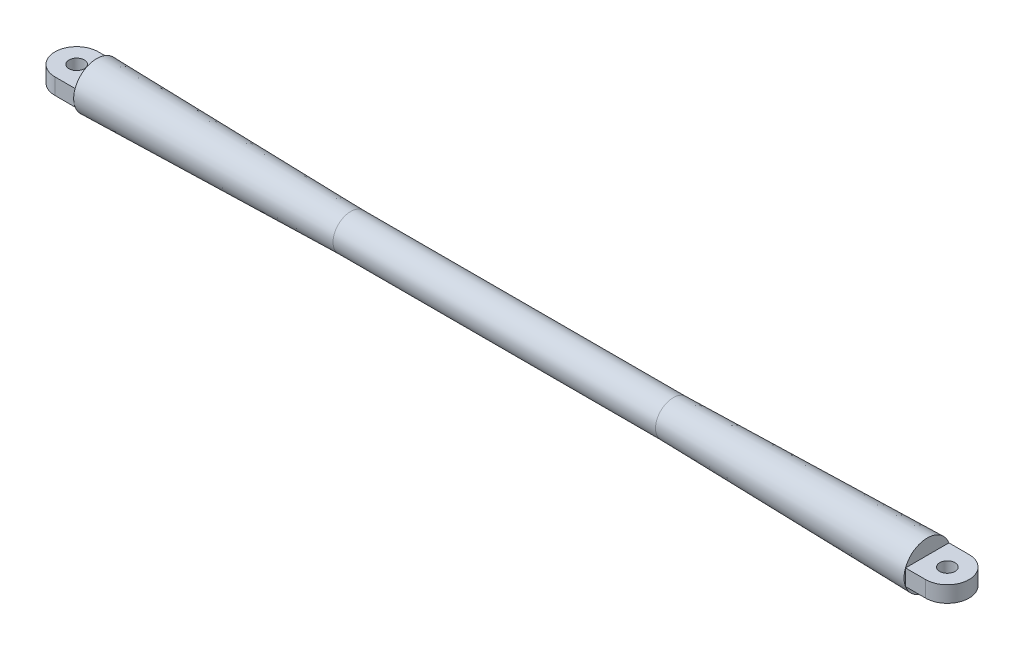
ISO-10303-21;
HEADER;
FILE_DESCRIPTION(('STEP AP214'),'2;1');
FILE_NAME('part.step','',(''),(''),'','','');
FILE_SCHEMA(('AUTOMOTIVE_DESIGN { 1 0 10303 214 1 1 1 1 }'));
ENDSEC;
DATA;
#1=APPLICATION_CONTEXT('core data for automotive mechanical design processes');
#2=APPLICATION_PROTOCOL_DEFINITION('international standard','automotive_design',2000,#1);
#3=PRODUCT_CONTEXT('',#1,'mechanical');
#4=PRODUCT('Part','Part','',(#3));
#5=PRODUCT_RELATED_PRODUCT_CATEGORY('part','',(#4));
#6=PRODUCT_DEFINITION_FORMATION('','',#4);
#7=PRODUCT_DEFINITION_CONTEXT('part definition',#1,'design');
#8=PRODUCT_DEFINITION('design','',#6,#7);
#9=PRODUCT_DEFINITION_SHAPE('','',#8);
#10=(LENGTH_UNIT() NAMED_UNIT(*) SI_UNIT(.MILLI.,.METRE.));
#11=(NAMED_UNIT(*) PLANE_ANGLE_UNIT() SI_UNIT($,.RADIAN.));
#12=(NAMED_UNIT(*) SI_UNIT($,.STERADIAN.) SOLID_ANGLE_UNIT());
#13=UNCERTAINTY_MEASURE_WITH_UNIT(LENGTH_MEASURE(1.E-05),#10,'distance_accuracy_value','');
#14=(GEOMETRIC_REPRESENTATION_CONTEXT(3) GLOBAL_UNCERTAINTY_ASSIGNED_CONTEXT((#13)) GLOBAL_UNIT_ASSIGNED_CONTEXT((#10,
#11,#12)) REPRESENTATION_CONTEXT('',''));
#15=CARTESIAN_POINT('',(0.,0.,0.));
#16=DIRECTION('',(0.,0.,1.));
#17=DIRECTION('',(1.,0.,0.));
#18=AXIS2_PLACEMENT_3D('',#15,#16,#17);
#19=CARTESIAN_POINT('',(575.,0.,0.));
#20=DIRECTION('',(1.,0.,0.));
#21=DIRECTION('',(0.,0.,-1.));
#22=AXIS2_PLACEMENT_3D('',#19,#20,#21);
#23=CONICAL_SURFACE('',#22,30.,0.0213300978711052);
#24=CARTESIAN_POINT('',(200.,0.,0.));
#25=DIRECTION('',(-1.,0.,0.));
#26=DIRECTION('',(0.,0.,1.));
#27=AXIS2_PLACEMENT_3D('',#24,#25,#26);
#28=CIRCLE('',#27,22.);
#29=CARTESIAN_POINT('',(200.,0.,22.));
#30=VERTEX_POINT('',#29);
#31=EDGE_CURVE('E182',#30,#30,#28,.T.);
#32=ORIENTED_EDGE('',*,*,#31,.F.);
#33=EDGE_LOOP('',(#32));
#34=FACE_BOUND('',#33,.T.);
#35=CARTESIAN_POINT('',(515.,0.,0.));
#36=DIRECTION('',(-1.,0.,0.));
#37=DIRECTION('',(0.,0.,1.));
#38=AXIS2_PLACEMENT_3D('',#35,#36,#37);
#39=CIRCLE('',#38,28.72);
#40=CARTESIAN_POINT('',(515.,10.,26.9228230317699));
#41=VERTEX_POINT('',#40);
#42=CARTESIAN_POINT('',(515.,10.,-26.9228230317699));
#43=VERTEX_POINT('',#42);
#44=EDGE_CURVE('E185',#41,#43,#39,.T.);
#45=ORIENTED_EDGE('',*,*,#44,.T.);
#46=CARTESIAN_POINT('',(515.,0.,0.));
#47=DIRECTION('',(-1.,0.,0.));
#48=DIRECTION('',(0.,-1.,0.));
#49=AXIS2_PLACEMENT_3D('',#46,#47,#48);
#50=CIRCLE('',#49,28.72);
#51=CARTESIAN_POINT('',(515.,-10.,-26.9228230317699));
#52=VERTEX_POINT('',#51);
#53=EDGE_CURVE('E173',#43,#52,#50,.T.);
#54=ORIENTED_EDGE('',*,*,#53,.T.);
#55=CARTESIAN_POINT('',(515.,0.,0.));
#56=DIRECTION('',(-1.,0.,0.));
#57=DIRECTION('',(0.,0.,1.));
#58=AXIS2_PLACEMENT_3D('',#55,#56,#57);
#59=CIRCLE('',#58,28.72);
#60=CARTESIAN_POINT('',(515.,-10.,26.9228230317699));
#61=VERTEX_POINT('',#60);
#62=EDGE_CURVE('E188',#52,#61,#59,.T.);
#63=ORIENTED_EDGE('',*,*,#62,.T.);
#64=CARTESIAN_POINT('',(515.,0.,0.));
#65=DIRECTION('',(-1.,0.,0.));
#66=DIRECTION('',(0.,-1.,0.));
#67=AXIS2_PLACEMENT_3D('',#64,#65,#66);
#68=CIRCLE('',#67,28.72);
#69=EDGE_CURVE('E170',#61,#41,#68,.T.);
#70=ORIENTED_EDGE('',*,*,#69,.T.);
#71=EDGE_LOOP('',(#45,#54,#63,#70));
#72=FACE_BOUND('',#71,.T.);
#73=ADVANCED_FACE('F32',(#34,#72),#23,.T.);
#74=CARTESIAN_POINT('',(0.,0.,0.));
#75=DIRECTION('',(-1.,0.,0.));
#76=DIRECTION('',(0.,0.,1.));
#77=AXIS2_PLACEMENT_3D('',#74,#75,#76);
#78=CYLINDRICAL_SURFACE('',#77,22.);
#79=ORIENTED_EDGE('',*,*,#31,.T.);
#80=EDGE_LOOP('',(#79));
#81=FACE_BOUND('',#80,.T.);
#82=CARTESIAN_POINT('',(-200.,0.,0.));
#83=DIRECTION('',(-1.,0.,0.));
#84=DIRECTION('',(0.,0.,1.));
#85=AXIS2_PLACEMENT_3D('',#82,#83,#84);
#86=CIRCLE('',#85,22.);
#87=CARTESIAN_POINT('',(-200.,0.,22.));
#88=VERTEX_POINT('',#87);
#89=EDGE_CURVE('E141',#88,#88,#86,.T.);
#90=ORIENTED_EDGE('',*,*,#89,.F.);
#91=EDGE_LOOP('',(#90));
#92=FACE_BOUND('',#91,.T.);
#93=ADVANCED_FACE('F224',(#81,#92),#78,.T.);
#94=CARTESIAN_POINT('',(515.,78.038595238584,-95.));
#95=DIRECTION('',(-1.,0.,0.));
#96=DIRECTION('',(0.,0.,1.));
#97=AXIS2_PLACEMENT_3D('',#94,#95,#96);
#98=PLANE('',#97);
#99=DIRECTION('',(0.,0.,1.));
#100=VECTOR('',#99,1.);
#101=CARTESIAN_POINT('',(515.,9.99999999999999,-95.));
#102=LINE('',#101,#100);
#103=EDGE_CURVE('E179',#43,#41,#102,.T.);
#104=ORIENTED_EDGE('',*,*,#103,.F.);
#105=ORIENTED_EDGE('',*,*,#44,.F.);
#106=EDGE_LOOP('',(#104,#105));
#107=FACE_BOUND('',#106,.T.);
#108=ADVANCED_FACE('F207',(#107),#98,.F.);
#109=CARTESIAN_POINT('',(515.,9.99999999999999,-95.));
#110=DIRECTION('',(0.,-1.,0.));
#111=DIRECTION('',(1.,0.,0.));
#112=AXIS2_PLACEMENT_3D('',#109,#110,#111);
#113=PLANE('',#112);
#114=CARTESIAN_POINT('',(540.,10.,0.));
#115=DIRECTION('',(0.,1.,0.));
#116=DIRECTION('',(-1.,0.,0.));
#117=AXIS2_PLACEMENT_3D('',#114,#115,#116);
#118=CIRCLE('',#117,9.49999999999995);
#119=CARTESIAN_POINT('',(530.5,9.99999999999999,0.));
#120=VERTEX_POINT('',#119);
#121=EDGE_CURVE('E149',#120,#120,#118,.T.);
#122=ORIENTED_EDGE('',*,*,#121,.F.);
#123=EDGE_LOOP('',(#122));
#124=FACE_BOUND('',#123,.T.);
#125=ORIENTED_EDGE('',*,*,#103,.T.);
#126=DIRECTION('',(1.,0.,0.));
#127=VECTOR('',#126,1.);
#128=CARTESIAN_POINT('',(515.,9.99999999999999,26.9228230317699));
#129=LINE('',#128,#127);
#130=CARTESIAN_POINT('',(540.,9.99999999999998,26.9228230317699));
#131=VERTEX_POINT('',#130);
#132=EDGE_CURVE('E55',#41,#131,#129,.T.);
#133=ORIENTED_EDGE('',*,*,#132,.T.);
#134=CARTESIAN_POINT('',(540.,9.99999999999998,0.));
#135=DIRECTION('',(0.,-1.,0.));
#136=DIRECTION('',(1.,0.,0.));
#137=AXIS2_PLACEMENT_3D('',#134,#135,#136);
#138=CIRCLE('',#137,26.9228230317699);
#139=CARTESIAN_POINT('',(540.,9.99999999999998,-26.9228230317699));
#140=VERTEX_POINT('',#139);
#141=EDGE_CURVE('E166',#131,#140,#138,.F.);
#142=ORIENTED_EDGE('',*,*,#141,.T.);
#143=DIRECTION('',(-1.,0.,0.));
#144=VECTOR('',#143,1.);
#145=CARTESIAN_POINT('',(515.,9.99999999999999,-26.9228230317699));
#146=LINE('',#145,#144);
#147=EDGE_CURVE('E157',#140,#43,#146,.T.);
#148=ORIENTED_EDGE('',*,*,#147,.T.);
#149=EDGE_LOOP('',(#125,#133,#142,#148));
#150=FACE_BOUND('',#149,.T.);
#151=ADVANCED_FACE('F203',(#124,#150),#113,.F.);
#152=CARTESIAN_POINT('',(515.,-78.038595238584,-95.));
#153=DIRECTION('',(-1.,0.,0.));
#154=DIRECTION('',(0.,0.,1.));
#155=AXIS2_PLACEMENT_3D('',#152,#153,#154);
#156=PLANE('',#155);
#157=DIRECTION('',(0.,0.,1.));
#158=VECTOR('',#157,1.);
#159=CARTESIAN_POINT('',(515.,-9.99999999999999,-95.));
#160=LINE('',#159,#158);
#161=EDGE_CURVE('E176',#52,#61,#160,.T.);
#162=ORIENTED_EDGE('',*,*,#161,.T.);
#163=ORIENTED_EDGE('',*,*,#62,.F.);
#164=EDGE_LOOP('',(#162,#163));
#165=FACE_BOUND('',#164,.T.);
#166=ADVANCED_FACE('F294',(#165),#156,.F.);
#167=CARTESIAN_POINT('',(515.,-9.99999999999999,-95.));
#168=DIRECTION('',(0.,1.,0.));
#169=DIRECTION('',(-1.,0.,0.));
#170=AXIS2_PLACEMENT_3D('',#167,#168,#169);
#171=PLANE('',#170);
#172=CARTESIAN_POINT('',(540.,-9.99999999999999,0.));
#173=DIRECTION('',(0.,1.,0.));
#174=DIRECTION('',(-1.,0.,0.));
#175=AXIS2_PLACEMENT_3D('',#172,#173,#174);
#176=CIRCLE('',#175,9.49999999999995);
#177=CARTESIAN_POINT('',(530.5,-9.99999999999999,0.));
#178=VERTEX_POINT('',#177);
#179=EDGE_CURVE('E35',#178,#178,#176,.T.);
#180=ORIENTED_EDGE('',*,*,#179,.T.);
#181=EDGE_LOOP('',(#180));
#182=FACE_BOUND('',#181,.T.);
#183=CARTESIAN_POINT('',(540.,-9.99999999999998,0.));
#184=DIRECTION('',(0.,1.,0.));
#185=DIRECTION('',(-1.,0.,0.));
#186=AXIS2_PLACEMENT_3D('',#183,#184,#185);
#187=CIRCLE('',#186,26.9228230317699);
#188=CARTESIAN_POINT('',(540.,-10.,-26.9228230317699));
#189=VERTEX_POINT('',#188);
#190=CARTESIAN_POINT('',(540.,-9.99999999999998,26.9228230317699));
#191=VERTEX_POINT('',#190);
#192=EDGE_CURVE('E40',#189,#191,#187,.F.);
#193=ORIENTED_EDGE('',*,*,#192,.T.);
#194=DIRECTION('',(-1.,0.,0.));
#195=VECTOR('',#194,1.);
#196=CARTESIAN_POINT('',(515.,-9.99999999999999,26.9228230317699));
#197=LINE('',#196,#195);
#198=EDGE_CURVE('E11',#191,#61,#197,.T.);
#199=ORIENTED_EDGE('',*,*,#198,.T.);
#200=ORIENTED_EDGE('',*,*,#161,.F.);
#201=DIRECTION('',(1.,0.,0.));
#202=VECTOR('',#201,1.);
#203=CARTESIAN_POINT('',(515.,-9.99999999999999,-26.9228230317699));
#204=LINE('',#203,#202);
#205=EDGE_CURVE('E191',#52,#189,#204,.T.);
#206=ORIENTED_EDGE('',*,*,#205,.T.);
#207=EDGE_LOOP('',(#193,#199,#200,#206));
#208=FACE_BOUND('',#207,.T.);
#209=ADVANCED_FACE('F196',(#182,#208),#171,.F.);
#210=CARTESIAN_POINT('',(515.,-145.,-26.9228230317699));
#211=DIRECTION('',(-1.,0.,0.));
#212=DIRECTION('',(0.,-1.,0.));
#213=AXIS2_PLACEMENT_3D('',#210,#211,#212);
#214=PLANE('',#213);
#215=DIRECTION('',(0.,1.,0.));
#216=VECTOR('',#215,1.);
#217=CARTESIAN_POINT('',(515.,-145.,-26.9228230317699));
#218=LINE('',#217,#216);
#219=EDGE_CURVE('E161',#52,#43,#218,.T.);
#220=ORIENTED_EDGE('',*,*,#219,.F.);
#221=ORIENTED_EDGE('',*,*,#53,.F.);
#222=EDGE_LOOP('',(#220,#221));
#223=FACE_BOUND('',#222,.T.);
#224=ADVANCED_FACE('F213',(#223),#214,.F.);
#225=CARTESIAN_POINT('',(515.,-145.,41.5076168607042));
#226=DIRECTION('',(-1.,0.,0.));
#227=DIRECTION('',(0.,-1.,0.));
#228=AXIS2_PLACEMENT_3D('',#225,#226,#227);
#229=PLANE('',#228);
#230=DIRECTION('',(0.,1.,0.));
#231=VECTOR('',#230,1.);
#232=CARTESIAN_POINT('',(515.,-145.,26.9228230317699));
#233=LINE('',#232,#231);
#234=EDGE_CURVE('E155',#61,#41,#233,.T.);
#235=ORIENTED_EDGE('',*,*,#234,.T.);
#236=ORIENTED_EDGE('',*,*,#69,.F.);
#237=EDGE_LOOP('',(#235,#236));
#238=FACE_BOUND('',#237,.T.);
#239=ADVANCED_FACE('F211',(#238),#229,.F.);
#240=CARTESIAN_POINT('',(540.,-145.,26.9228230317699));
#241=DIRECTION('',(0.,0.,-1.));
#242=DIRECTION('',(-1.,0.,0.));
#243=AXIS2_PLACEMENT_3D('',#240,#241,#242);
#244=PLANE('',#243);
#245=ORIENTED_EDGE('',*,*,#234,.F.);
#246=ORIENTED_EDGE('',*,*,#198,.F.);
#247=DIRECTION('',(0.,1.,0.));
#248=VECTOR('',#247,1.);
#249=CARTESIAN_POINT('',(540.,-145.,26.9228230317699));
#250=LINE('',#249,#248);
#251=EDGE_CURVE('E158',#191,#131,#250,.T.);
#252=ORIENTED_EDGE('',*,*,#251,.T.);
#253=ORIENTED_EDGE('',*,*,#132,.F.);
#254=EDGE_LOOP('',(#245,#246,#252,#253));
#255=FACE_BOUND('',#254,.T.);
#256=ADVANCED_FACE('F201',(#255),#244,.F.);
#257=CARTESIAN_POINT('',(540.,-145.,0.));
#258=DIRECTION('',(0.,1.,0.));
#259=DIRECTION('',(-1.,0.,0.));
#260=AXIS2_PLACEMENT_3D('',#257,#258,#259);
#261=CYLINDRICAL_SURFACE('',#260,26.9228230317699);
#262=ORIENTED_EDGE('',*,*,#251,.F.);
#263=ORIENTED_EDGE('',*,*,#192,.F.);
#264=DIRECTION('',(0.,1.,0.));
#265=VECTOR('',#264,1.);
#266=CARTESIAN_POINT('',(540.,-145.,-26.9228230317699));
#267=LINE('',#266,#265);
#268=EDGE_CURVE('E47',#189,#140,#267,.T.);
#269=ORIENTED_EDGE('',*,*,#268,.T.);
#270=ORIENTED_EDGE('',*,*,#141,.F.);
#271=EDGE_LOOP('',(#262,#263,#269,#270));
#272=FACE_BOUND('',#271,.T.);
#273=ADVANCED_FACE('F200',(#272),#261,.T.);
#274=CARTESIAN_POINT('',(515.,-145.,-26.9228230317699));
#275=DIRECTION('',(0.,0.,1.));
#276=DIRECTION('',(1.,0.,0.));
#277=AXIS2_PLACEMENT_3D('',#274,#275,#276);
#278=PLANE('',#277);
#279=ORIENTED_EDGE('',*,*,#268,.F.);
#280=ORIENTED_EDGE('',*,*,#205,.F.);
#281=ORIENTED_EDGE('',*,*,#219,.T.);
#282=ORIENTED_EDGE('',*,*,#147,.F.);
#283=EDGE_LOOP('',(#279,#280,#281,#282));
#284=FACE_BOUND('',#283,.T.);
#285=ADVANCED_FACE('F282',(#284),#278,.F.);
#286=CARTESIAN_POINT('',(540.,-28.72,0.));
#287=DIRECTION('',(0.,1.,0.));
#288=DIRECTION('',(-1.,0.,0.));
#289=AXIS2_PLACEMENT_3D('',#286,#287,#288);
#290=CYLINDRICAL_SURFACE('',#289,9.49999999999995);
#291=CARTESIAN_POINT('',(530.5,9.99999999999999,0.));
#292=CARTESIAN_POINT('',(530.5,9.79166666666666,0.));
#293=CARTESIAN_POINT('',(530.5,9.58333333333333,0.));
#294=CARTESIAN_POINT('',(530.5,9.16666666666666,0.));
#295=CARTESIAN_POINT('',(530.5,8.95833333333333,0.));
#296=CARTESIAN_POINT('',(530.5,8.54166666666666,0.));
#297=CARTESIAN_POINT('',(530.5,8.33333333333333,0.));
#298=CARTESIAN_POINT('',(530.5,7.91666666666666,0.));
#299=CARTESIAN_POINT('',(530.5,7.70833333333333,0.));
#300=CARTESIAN_POINT('',(530.5,7.29166666666666,0.));
#301=CARTESIAN_POINT('',(530.5,7.08333333333333,0.));
#302=CARTESIAN_POINT('',(530.5,6.66666666666667,0.));
#303=CARTESIAN_POINT('',(530.5,6.45833333333333,0.));
#304=CARTESIAN_POINT('',(530.5,6.04166666666667,0.));
#305=CARTESIAN_POINT('',(530.5,5.83333333333333,0.));
#306=CARTESIAN_POINT('',(530.5,5.41666666666666,0.));
#307=CARTESIAN_POINT('',(530.5,5.20833333333333,0.));
#308=CARTESIAN_POINT('',(530.5,4.79166666666666,0.));
#309=CARTESIAN_POINT('',(530.5,4.58333333333333,0.));
#310=CARTESIAN_POINT('',(530.5,4.16666666666666,0.));
#311=CARTESIAN_POINT('',(530.5,3.95833333333333,0.));
#312=CARTESIAN_POINT('',(530.5,3.54166666666666,0.));
#313=CARTESIAN_POINT('',(530.5,3.33333333333333,0.));
#314=CARTESIAN_POINT('',(530.5,2.91666666666666,0.));
#315=CARTESIAN_POINT('',(530.5,2.70833333333333,0.));
#316=CARTESIAN_POINT('',(530.5,2.29166666666667,0.));
#317=CARTESIAN_POINT('',(530.5,2.08333333333334,0.));
#318=CARTESIAN_POINT('',(530.5,1.66666666666667,0.));
#319=CARTESIAN_POINT('',(530.5,1.45833333333334,0.));
#320=CARTESIAN_POINT('',(530.5,1.04166666666667,0.));
#321=CARTESIAN_POINT('',(530.5,0.833333333333337,0.));
#322=CARTESIAN_POINT('',(530.5,0.416666666666671,0.));
#323=CARTESIAN_POINT('',(530.5,0.208333333333337,0.));
#324=CARTESIAN_POINT('',(530.5,-0.20833333333333,0.));
#325=CARTESIAN_POINT('',(530.5,-0.416666666666664,0.));
#326=CARTESIAN_POINT('',(530.5,-0.833333333333331,0.));
#327=CARTESIAN_POINT('',(530.5,-1.04166666666666,0.));
#328=CARTESIAN_POINT('',(530.5,-1.45833333333333,0.));
#329=CARTESIAN_POINT('',(530.5,-1.66666666666666,0.));
#330=CARTESIAN_POINT('',(530.5,-2.08333333333333,0.));
#331=CARTESIAN_POINT('',(530.5,-2.29166666666666,0.));
#332=CARTESIAN_POINT('',(530.5,-2.70833333333333,0.));
#333=CARTESIAN_POINT('',(530.5,-2.91666666666666,0.));
#334=CARTESIAN_POINT('',(530.5,-3.33333333333333,0.));
#335=CARTESIAN_POINT('',(530.5,-3.54166666666666,0.));
#336=CARTESIAN_POINT('',(530.5,-3.95833333333333,0.));
#337=CARTESIAN_POINT('',(530.5,-4.16666666666666,0.));
#338=CARTESIAN_POINT('',(530.5,-4.58333333333333,0.));
#339=CARTESIAN_POINT('',(530.5,-4.79166666666666,0.));
#340=CARTESIAN_POINT('',(530.5,-5.20833333333333,0.));
#341=CARTESIAN_POINT('',(530.5,-5.41666666666666,0.));
#342=CARTESIAN_POINT('',(530.5,-5.83333333333333,0.));
#343=CARTESIAN_POINT('',(530.5,-6.04166666666666,0.));
#344=CARTESIAN_POINT('',(530.5,-6.45833333333333,0.));
#345=CARTESIAN_POINT('',(530.5,-6.66666666666666,0.));
#346=CARTESIAN_POINT('',(530.5,-7.08333333333333,0.));
#347=CARTESIAN_POINT('',(530.5,-7.29166666666666,0.));
#348=CARTESIAN_POINT('',(530.5,-7.70833333333333,0.));
#349=CARTESIAN_POINT('',(530.5,-7.91666666666666,0.));
#350=CARTESIAN_POINT('',(530.5,-8.33333333333333,0.));
#351=CARTESIAN_POINT('',(530.5,-8.54166666666666,0.));
#352=CARTESIAN_POINT('',(530.5,-8.95833333333332,0.));
#353=CARTESIAN_POINT('',(530.5,-9.16666666666666,0.));
#354=CARTESIAN_POINT('',(530.5,-9.58333333333332,0.));
#355=CARTESIAN_POINT('',(530.5,-9.79166666666666,0.));
#356=CARTESIAN_POINT('',(530.5,-9.99999999999999,0.));
#357=B_SPLINE_CURVE_WITH_KNOTS('',3,(#291,#292,#293,#294,#295,#296,#297,#298,#299,#300,#301,
#302,#303,#304,#305,#306,#307,#308,#309,#310,#311,#312,#313,#314,#315,#316,#317,#318,#319,#320,
#321,#322,#323,#324,#325,#326,#327,#328,#329,#330,#331,#332,#333,#334,#335,#336,#337,#338,#339,
#340,#341,#342,#343,#344,#345,#346,#347,#348,#349,#350,#351,#352,#353,#354,#355,#356),
.UNSPECIFIED.,.F.,.F.,(4,2,2,2,2,2,2,2,2,2,2,2,2,2,2,2,2,2,2,2,2,2,2,2,2,2,2,2,2,2,2,2,4),(0.,
0.625000000000001,1.25,1.875,2.5,3.125,3.75,4.375,5.,5.625,6.25,6.875,7.49999999999999,
8.12499999999999,8.74999999999999,9.37499999999999,9.99999999999999,10.625,11.25,11.875,12.5,
13.125,13.75,14.375,15.,15.625,16.25,16.875,17.5,18.125,18.75,19.375,20.),.UNSPECIFIED.);
#358=EDGE_CURVE('BSEAM280',#120,#178,#357,.T.);
#359=ORIENTED_EDGE('',*,*,#121,.T.);
#360=ORIENTED_EDGE('',*,*,#179,.F.);
#361=ORIENTED_EDGE('',*,*,#358,.T.);
#362=ORIENTED_EDGE('',*,*,#358,.F.);
#363=EDGE_LOOP('',(#359,#361,#360,#362));
#364=FACE_BOUND('',#363,.T.);
#365=ADVANCED_FACE('F280',(#364),#290,.F.);
#366=CARTESIAN_POINT('',(-575.,0.,0.));
#367=DIRECTION('',(-1.,0.,0.));
#368=DIRECTION('',(0.,0.,-1.));
#369=AXIS2_PLACEMENT_3D('',#366,#367,#368);
#370=CONICAL_SURFACE('',#369,30.,0.0213300978711052);
#371=ORIENTED_EDGE('',*,*,#89,.T.);
#372=EDGE_LOOP('',(#371));
#373=FACE_BOUND('',#372,.T.);
#374=CARTESIAN_POINT('',(-515.,0.,0.));
#375=DIRECTION('',(-1.,0.,0.));
#376=DIRECTION('',(0.,0.,1.));
#377=AXIS2_PLACEMENT_3D('',#374,#375,#376);
#378=CIRCLE('',#377,28.72);
#379=CARTESIAN_POINT('',(-515.,10.,26.9228230317699));
#380=VERTEX_POINT('',#379);
#381=CARTESIAN_POINT('',(-515.,10.,-26.9228230317699));
#382=VERTEX_POINT('',#381);
#383=EDGE_CURVE('E139',#380,#382,#378,.T.);
#384=ORIENTED_EDGE('',*,*,#383,.F.);
#385=CARTESIAN_POINT('',(-515.,0.,0.));
#386=DIRECTION('',(-1.,0.,0.));
#387=DIRECTION('',(0.,-1.,0.));
#388=AXIS2_PLACEMENT_3D('',#385,#386,#387);
#389=CIRCLE('',#388,28.72);
#390=CARTESIAN_POINT('',(-515.,-10.,26.9228230317699));
#391=VERTEX_POINT('',#390);
#392=EDGE_CURVE('E135',#391,#380,#389,.T.);
#393=ORIENTED_EDGE('',*,*,#392,.F.);
#394=CARTESIAN_POINT('',(-515.,0.,0.));
#395=DIRECTION('',(-1.,0.,0.));
#396=DIRECTION('',(0.,0.,1.));
#397=AXIS2_PLACEMENT_3D('',#394,#395,#396);
#398=CIRCLE('',#397,28.72);
#399=CARTESIAN_POINT('',(-515.,-10.,-26.9228230317699));
#400=VERTEX_POINT('',#399);
#401=EDGE_CURVE('E121',#400,#391,#398,.T.);
#402=ORIENTED_EDGE('',*,*,#401,.F.);
#403=CARTESIAN_POINT('',(-515.,0.,0.));
#404=DIRECTION('',(-1.,0.,0.));
#405=DIRECTION('',(0.,-1.,0.));
#406=AXIS2_PLACEMENT_3D('',#403,#404,#405);
#407=CIRCLE('',#406,28.72);
#408=EDGE_CURVE('E128',#382,#400,#407,.T.);
#409=ORIENTED_EDGE('',*,*,#408,.F.);
#410=EDGE_LOOP('',(#384,#393,#402,#409));
#411=FACE_BOUND('',#410,.T.);
#412=ADVANCED_FACE('F137',(#373,#411),#370,.T.);
#413=CARTESIAN_POINT('',(-515.,78.038595238584,-95.));
#414=DIRECTION('',(1.,0.,0.));
#415=DIRECTION('',(0.,0.,1.));
#416=AXIS2_PLACEMENT_3D('',#413,#414,#415);
#417=PLANE('',#416);
#418=DIRECTION('',(0.,0.,1.));
#419=VECTOR('',#418,1.);
#420=CARTESIAN_POINT('',(-515.,9.99999999999999,-95.));
#421=LINE('',#420,#419);
#422=EDGE_CURVE('E127',#382,#380,#421,.T.);
#423=ORIENTED_EDGE('',*,*,#422,.T.);
#424=ORIENTED_EDGE('',*,*,#383,.T.);
#425=EDGE_LOOP('',(#423,#424));
#426=FACE_BOUND('',#425,.T.);
#427=ADVANCED_FACE('F275',(#426),#417,.F.);
#428=CARTESIAN_POINT('',(-515.,9.99999999999999,-95.));
#429=DIRECTION('',(0.,-1.,0.));
#430=DIRECTION('',(-1.,0.,0.));
#431=AXIS2_PLACEMENT_3D('',#428,#429,#430);
#432=PLANE('',#431);
#433=CARTESIAN_POINT('',(-540.,10.,0.));
#434=DIRECTION('',(0.,-1.,0.));
#435=DIRECTION('',(1.,0.,0.));
#436=AXIS2_PLACEMENT_3D('',#433,#434,#435);
#437=CIRCLE('',#436,9.49999999999995);
#438=CARTESIAN_POINT('',(-530.5,9.99999999999999,0.));
#439=VERTEX_POINT('',#438);
#440=EDGE_CURVE('E152',#439,#439,#437,.T.);
#441=ORIENTED_EDGE('',*,*,#440,.T.);
#442=EDGE_LOOP('',(#441));
#443=FACE_BOUND('',#442,.T.);
#444=ORIENTED_EDGE('',*,*,#422,.F.);
#445=DIRECTION('',(1.,0.,0.));
#446=VECTOR('',#445,1.);
#447=CARTESIAN_POINT('',(-515.,9.99999999999999,-26.9228230317699));
#448=LINE('',#447,#446);
#449=CARTESIAN_POINT('',(-540.,9.99999999999998,-26.9228230317699));
#450=VERTEX_POINT('',#449);
#451=EDGE_CURVE('E105',#450,#382,#448,.T.);
#452=ORIENTED_EDGE('',*,*,#451,.F.);
#453=CARTESIAN_POINT('',(-540.,9.99999999999998,0.));
#454=DIRECTION('',(0.,1.,0.));
#455=DIRECTION('',(-1.,0.,0.));
#456=AXIS2_PLACEMENT_3D('',#453,#454,#455);
#457=CIRCLE('',#456,26.9228230317699);
#458=CARTESIAN_POINT('',(-540.,9.99999999999998,26.9228230317699));
#459=VERTEX_POINT('',#458);
#460=EDGE_CURVE('E242',#459,#450,#457,.F.);
#461=ORIENTED_EDGE('',*,*,#460,.F.);
#462=DIRECTION('',(-1.,0.,0.));
#463=VECTOR('',#462,1.);
#464=CARTESIAN_POINT('',(-515.,9.99999999999999,26.9228230317699));
#465=LINE('',#464,#463);
#466=EDGE_CURVE('E239',#380,#459,#465,.T.);
#467=ORIENTED_EDGE('',*,*,#466,.F.);
#468=EDGE_LOOP('',(#444,#452,#461,#467));
#469=FACE_BOUND('',#468,.T.);
#470=ADVANCED_FACE('F254',(#443,#469),#432,.F.);
#471=CARTESIAN_POINT('',(-515.,-78.038595238584,-95.));
#472=DIRECTION('',(1.,0.,0.));
#473=DIRECTION('',(0.,0.,1.));
#474=AXIS2_PLACEMENT_3D('',#471,#472,#473);
#475=PLANE('',#474);
#476=DIRECTION('',(0.,0.,1.));
#477=VECTOR('',#476,1.);
#478=CARTESIAN_POINT('',(-515.,-9.99999999999999,-95.));
#479=LINE('',#478,#477);
#480=EDGE_CURVE('E117',#400,#391,#479,.T.);
#481=ORIENTED_EDGE('',*,*,#480,.F.);
#482=ORIENTED_EDGE('',*,*,#401,.T.);
#483=EDGE_LOOP('',(#481,#482));
#484=FACE_BOUND('',#483,.T.);
#485=ADVANCED_FACE('F124',(#484),#475,.F.);
#486=CARTESIAN_POINT('',(-515.,-9.99999999999999,-95.));
#487=DIRECTION('',(0.,1.,0.));
#488=DIRECTION('',(1.,0.,0.));
#489=AXIS2_PLACEMENT_3D('',#486,#487,#488);
#490=PLANE('',#489);
#491=CARTESIAN_POINT('',(-540.,-9.99999999999999,0.));
#492=DIRECTION('',(0.,-1.,0.));
#493=DIRECTION('',(1.,0.,0.));
#494=AXIS2_PLACEMENT_3D('',#491,#492,#493);
#495=CIRCLE('',#494,9.49999999999995);
#496=CARTESIAN_POINT('',(-530.5,-9.99999999999999,0.));
#497=VERTEX_POINT('',#496);
#498=EDGE_CURVE('E110',#497,#497,#495,.T.);
#499=ORIENTED_EDGE('',*,*,#498,.F.);
#500=EDGE_LOOP('',(#499));
#501=FACE_BOUND('',#500,.T.);
#502=CARTESIAN_POINT('',(-540.,-9.99999999999998,0.));
#503=DIRECTION('',(0.,-1.,0.));
#504=DIRECTION('',(1.,0.,0.));
#505=AXIS2_PLACEMENT_3D('',#502,#503,#504);
#506=CIRCLE('',#505,26.9228230317699);
#507=CARTESIAN_POINT('',(-540.,-10.,-26.9228230317699));
#508=VERTEX_POINT('',#507);
#509=CARTESIAN_POINT('',(-540.,-9.99999999999998,26.9228230317699));
#510=VERTEX_POINT('',#509);
#511=EDGE_CURVE('E120',#508,#510,#506,.F.);
#512=ORIENTED_EDGE('',*,*,#511,.F.);
#513=DIRECTION('',(-1.,0.,0.));
#514=VECTOR('',#513,1.);
#515=CARTESIAN_POINT('',(-515.,-9.99999999999999,-26.9228230317699));
#516=LINE('',#515,#514);
#517=EDGE_CURVE('E102',#400,#508,#516,.T.);
#518=ORIENTED_EDGE('',*,*,#517,.F.);
#519=ORIENTED_EDGE('',*,*,#480,.T.);
#520=DIRECTION('',(1.,0.,0.));
#521=VECTOR('',#520,1.);
#522=CARTESIAN_POINT('',(-515.,-9.99999999999999,26.9228230317699));
#523=LINE('',#522,#521);
#524=EDGE_CURVE('E146',#510,#391,#523,.T.);
#525=ORIENTED_EDGE('',*,*,#524,.F.);
#526=EDGE_LOOP('',(#512,#518,#519,#525));
#527=FACE_BOUND('',#526,.T.);
#528=ADVANCED_FACE('F115',(#501,#527),#490,.F.);
#529=CARTESIAN_POINT('',(-515.,-145.,-26.9228230317699));
#530=DIRECTION('',(1.,0.,0.));
#531=DIRECTION('',(0.,-1.,0.));
#532=AXIS2_PLACEMENT_3D('',#529,#530,#531);
#533=PLANE('',#532);
#534=DIRECTION('',(0.,1.,0.));
#535=VECTOR('',#534,1.);
#536=CARTESIAN_POINT('',(-515.,-145.,-26.9228230317699));
#537=LINE('',#536,#535);
#538=EDGE_CURVE('E99',#400,#382,#537,.T.);
#539=ORIENTED_EDGE('',*,*,#538,.T.);
#540=ORIENTED_EDGE('',*,*,#408,.T.);
#541=EDGE_LOOP('',(#539,#540));
#542=FACE_BOUND('',#541,.T.);
#543=ADVANCED_FACE('F131',(#542),#533,.F.);
#544=CARTESIAN_POINT('',(-515.,-145.,41.5076168607042));
#545=DIRECTION('',(1.,0.,0.));
#546=DIRECTION('',(0.,-1.,0.));
#547=AXIS2_PLACEMENT_3D('',#544,#545,#546);
#548=PLANE('',#547);
#549=DIRECTION('',(0.,1.,0.));
#550=VECTOR('',#549,1.);
#551=CARTESIAN_POINT('',(-515.,-145.,26.9228230317699));
#552=LINE('',#551,#550);
#553=EDGE_CURVE('E245',#391,#380,#552,.T.);
#554=ORIENTED_EDGE('',*,*,#553,.F.);
#555=ORIENTED_EDGE('',*,*,#392,.T.);
#556=EDGE_LOOP('',(#554,#555));
#557=FACE_BOUND('',#556,.T.);
#558=ADVANCED_FACE('F269',(#557),#548,.F.);
#559=CARTESIAN_POINT('',(-540.,-145.,26.9228230317699));
#560=DIRECTION('',(0.,0.,-1.));
#561=DIRECTION('',(1.,0.,0.));
#562=AXIS2_PLACEMENT_3D('',#559,#560,#561);
#563=PLANE('',#562);
#564=ORIENTED_EDGE('',*,*,#553,.T.);
#565=ORIENTED_EDGE('',*,*,#466,.T.);
#566=DIRECTION('',(0.,1.,0.));
#567=VECTOR('',#566,1.);
#568=CARTESIAN_POINT('',(-540.,-145.,26.9228230317699));
#569=LINE('',#568,#567);
#570=EDGE_CURVE('E248',#510,#459,#569,.T.);
#571=ORIENTED_EDGE('',*,*,#570,.F.);
#572=ORIENTED_EDGE('',*,*,#524,.T.);
#573=EDGE_LOOP('',(#564,#565,#571,#572));
#574=FACE_BOUND('',#573,.T.);
#575=ADVANCED_FACE('F407',(#574),#563,.F.);
#576=CARTESIAN_POINT('',(-540.,-145.,0.));
#577=DIRECTION('',(0.,1.,0.));
#578=DIRECTION('',(1.,0.,0.));
#579=AXIS2_PLACEMENT_3D('',#576,#577,#578);
#580=CYLINDRICAL_SURFACE('',#579,26.9228230317699);
#581=ORIENTED_EDGE('',*,*,#570,.T.);
#582=ORIENTED_EDGE('',*,*,#460,.T.);
#583=DIRECTION('',(0.,1.,0.));
#584=VECTOR('',#583,1.);
#585=CARTESIAN_POINT('',(-540.,-145.,-26.9228230317699));
#586=LINE('',#585,#584);
#587=EDGE_CURVE('E109',#508,#450,#586,.T.);
#588=ORIENTED_EDGE('',*,*,#587,.F.);
#589=ORIENTED_EDGE('',*,*,#511,.T.);
#590=EDGE_LOOP('',(#581,#582,#588,#589));
#591=FACE_BOUND('',#590,.T.);
#592=ADVANCED_FACE('F416',(#591),#580,.T.);
#593=CARTESIAN_POINT('',(-515.,-145.,-26.9228230317699));
#594=DIRECTION('',(0.,0.,1.));
#595=DIRECTION('',(-1.,0.,0.));
#596=AXIS2_PLACEMENT_3D('',#593,#594,#595);
#597=PLANE('',#596);
#598=ORIENTED_EDGE('',*,*,#587,.T.);
#599=ORIENTED_EDGE('',*,*,#451,.T.);
#600=ORIENTED_EDGE('',*,*,#538,.F.);
#601=ORIENTED_EDGE('',*,*,#517,.T.);
#602=EDGE_LOOP('',(#598,#599,#600,#601));
#603=FACE_BOUND('',#602,.T.);
#604=ADVANCED_FACE('F101',(#603),#597,.F.);
#605=CARTESIAN_POINT('',(-540.,-28.72,0.));
#606=DIRECTION('',(0.,1.,0.));
#607=DIRECTION('',(1.,0.,0.));
#608=AXIS2_PLACEMENT_3D('',#605,#606,#607);
#609=CYLINDRICAL_SURFACE('',#608,9.49999999999995);
#610=CARTESIAN_POINT('',(-530.5,9.99999999999999,0.));
#611=CARTESIAN_POINT('',(-530.5,9.79166666666666,0.));
#612=CARTESIAN_POINT('',(-530.5,9.58333333333333,0.));
#613=CARTESIAN_POINT('',(-530.5,9.16666666666666,0.));
#614=CARTESIAN_POINT('',(-530.5,8.95833333333333,0.));
#615=CARTESIAN_POINT('',(-530.5,8.54166666666666,0.));
#616=CARTESIAN_POINT('',(-530.5,8.33333333333333,0.));
#617=CARTESIAN_POINT('',(-530.5,7.91666666666666,0.));
#618=CARTESIAN_POINT('',(-530.5,7.70833333333333,0.));
#619=CARTESIAN_POINT('',(-530.5,7.29166666666666,0.));
#620=CARTESIAN_POINT('',(-530.5,7.08333333333333,0.));
#621=CARTESIAN_POINT('',(-530.5,6.66666666666667,0.));
#622=CARTESIAN_POINT('',(-530.5,6.45833333333333,0.));
#623=CARTESIAN_POINT('',(-530.5,6.04166666666667,0.));
#624=CARTESIAN_POINT('',(-530.5,5.83333333333333,0.));
#625=CARTESIAN_POINT('',(-530.5,5.41666666666666,0.));
#626=CARTESIAN_POINT('',(-530.5,5.20833333333333,0.));
#627=CARTESIAN_POINT('',(-530.5,4.79166666666666,0.));
#628=CARTESIAN_POINT('',(-530.5,4.58333333333333,0.));
#629=CARTESIAN_POINT('',(-530.5,4.16666666666666,0.));
#630=CARTESIAN_POINT('',(-530.5,3.95833333333333,0.));
#631=CARTESIAN_POINT('',(-530.5,3.54166666666666,0.));
#632=CARTESIAN_POINT('',(-530.5,3.33333333333333,0.));
#633=CARTESIAN_POINT('',(-530.5,2.91666666666666,0.));
#634=CARTESIAN_POINT('',(-530.5,2.70833333333333,0.));
#635=CARTESIAN_POINT('',(-530.5,2.29166666666667,0.));
#636=CARTESIAN_POINT('',(-530.5,2.08333333333334,0.));
#637=CARTESIAN_POINT('',(-530.5,1.66666666666667,0.));
#638=CARTESIAN_POINT('',(-530.5,1.45833333333334,0.));
#639=CARTESIAN_POINT('',(-530.5,1.04166666666667,0.));
#640=CARTESIAN_POINT('',(-530.5,0.833333333333337,0.));
#641=CARTESIAN_POINT('',(-530.5,0.416666666666671,0.));
#642=CARTESIAN_POINT('',(-530.5,0.208333333333337,0.));
#643=CARTESIAN_POINT('',(-530.5,-0.20833333333333,0.));
#644=CARTESIAN_POINT('',(-530.5,-0.416666666666664,0.));
#645=CARTESIAN_POINT('',(-530.5,-0.833333333333331,0.));
#646=CARTESIAN_POINT('',(-530.5,-1.04166666666666,0.));
#647=CARTESIAN_POINT('',(-530.5,-1.45833333333333,0.));
#648=CARTESIAN_POINT('',(-530.5,-1.66666666666666,0.));
#649=CARTESIAN_POINT('',(-530.5,-2.08333333333333,0.));
#650=CARTESIAN_POINT('',(-530.5,-2.29166666666666,0.));
#651=CARTESIAN_POINT('',(-530.5,-2.70833333333333,0.));
#652=CARTESIAN_POINT('',(-530.5,-2.91666666666666,0.));
#653=CARTESIAN_POINT('',(-530.5,-3.33333333333333,0.));
#654=CARTESIAN_POINT('',(-530.5,-3.54166666666666,0.));
#655=CARTESIAN_POINT('',(-530.5,-3.95833333333333,0.));
#656=CARTESIAN_POINT('',(-530.5,-4.16666666666666,0.));
#657=CARTESIAN_POINT('',(-530.5,-4.58333333333333,0.));
#658=CARTESIAN_POINT('',(-530.5,-4.79166666666666,0.));
#659=CARTESIAN_POINT('',(-530.5,-5.20833333333333,0.));
#660=CARTESIAN_POINT('',(-530.5,-5.41666666666666,0.));
#661=CARTESIAN_POINT('',(-530.5,-5.83333333333333,0.));
#662=CARTESIAN_POINT('',(-530.5,-6.04166666666666,0.));
#663=CARTESIAN_POINT('',(-530.5,-6.45833333333333,0.));
#664=CARTESIAN_POINT('',(-530.5,-6.66666666666666,0.));
#665=CARTESIAN_POINT('',(-530.5,-7.08333333333333,0.));
#666=CARTESIAN_POINT('',(-530.5,-7.29166666666666,0.));
#667=CARTESIAN_POINT('',(-530.5,-7.70833333333333,0.));
#668=CARTESIAN_POINT('',(-530.5,-7.91666666666666,0.));
#669=CARTESIAN_POINT('',(-530.5,-8.33333333333333,0.));
#670=CARTESIAN_POINT('',(-530.5,-8.54166666666666,0.));
#671=CARTESIAN_POINT('',(-530.5,-8.95833333333332,0.));
#672=CARTESIAN_POINT('',(-530.5,-9.16666666666666,0.));
#673=CARTESIAN_POINT('',(-530.5,-9.58333333333332,0.));
#674=CARTESIAN_POINT('',(-530.5,-9.79166666666666,0.));
#675=CARTESIAN_POINT('',(-530.5,-9.99999999999999,0.));
#676=B_SPLINE_CURVE_WITH_KNOTS('',3,(#610,#611,#612,#613,#614,#615,#616,#617,#618,#619,#620,
#621,#622,#623,#624,#625,#626,#627,#628,#629,#630,#631,#632,#633,#634,#635,#636,#637,#638,#639,
#640,#641,#642,#643,#644,#645,#646,#647,#648,#649,#650,#651,#652,#653,#654,#655,#656,#657,#658,
#659,#660,#661,#662,#663,#664,#665,#666,#667,#668,#669,#670,#671,#672,#673,#674,#675),
.UNSPECIFIED.,.F.,.F.,(4,2,2,2,2,2,2,2,2,2,2,2,2,2,2,2,2,2,2,2,2,2,2,2,2,2,2,2,2,2,2,2,4),(0.,
0.625000000000001,1.25,1.875,2.5,3.125,3.75,4.375,5.,5.625,6.25,6.875,7.49999999999999,
8.12499999999999,8.74999999999999,9.37499999999999,9.99999999999999,10.625,11.25,11.875,12.5,
13.125,13.75,14.375,15.,15.625,16.25,16.875,17.5,18.125,18.75,19.375,20.),.UNSPECIFIED.);
#677=EDGE_CURVE('BSEAM257',#439,#497,#676,.T.);
#678=ORIENTED_EDGE('',*,*,#440,.F.);
#679=ORIENTED_EDGE('',*,*,#498,.T.);
#680=ORIENTED_EDGE('',*,*,#677,.T.);
#681=ORIENTED_EDGE('',*,*,#677,.F.);
#682=EDGE_LOOP('',(#678,#680,#679,#681));
#683=FACE_BOUND('',#682,.T.);
#684=ADVANCED_FACE('F257',(#683),#609,.F.);
#685=CLOSED_SHELL('',(#73,#93,#108,#151,#166,#209,#224,#239,#256,#273,#285,#365,#412,#427,#470,
#485,#528,#543,#558,#575,#592,#604,#684));
#686=MANIFOLD_SOLID_BREP('B2',#685);
#687=ADVANCED_BREP_SHAPE_REPRESENTATION('',(#18,#686),#14);
#688=SHAPE_DEFINITION_REPRESENTATION(#9,#687);
ENDSEC;
END-ISO-10303-21;
